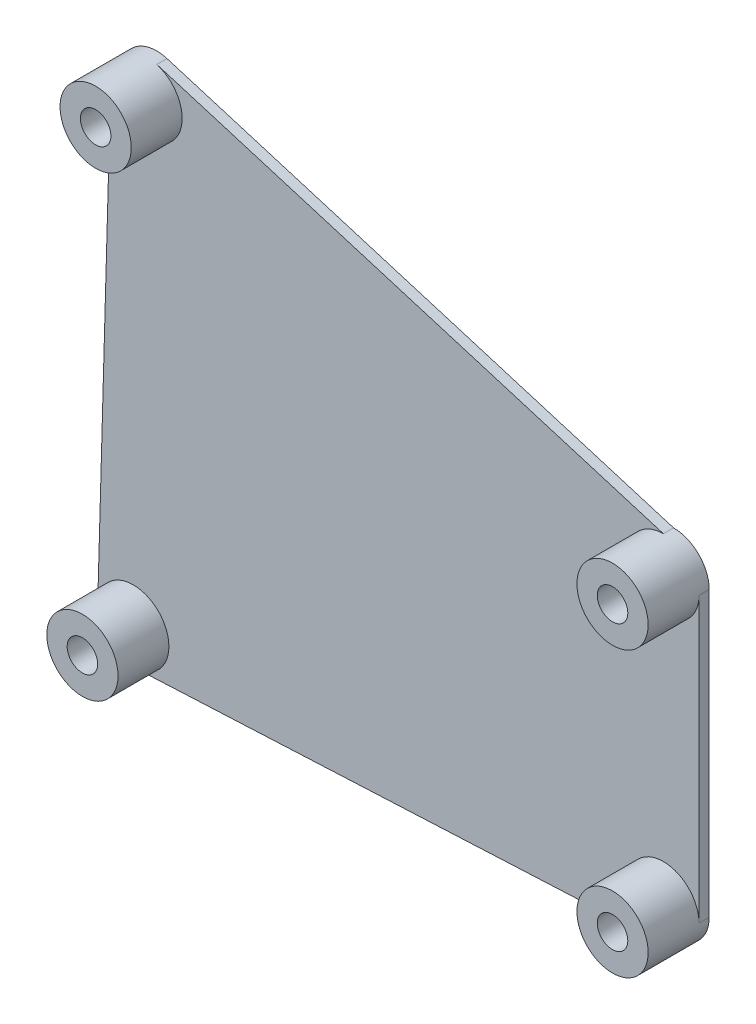
ISO-10303-21;
HEADER;
FILE_DESCRIPTION(('STEP AP214'),'2;1');
FILE_NAME('part.step','',(''),(''),'','','');
FILE_SCHEMA(('AUTOMOTIVE_DESIGN { 1 0 10303 214 1 1 1 1 }'));
ENDSEC;
DATA;
#1=APPLICATION_CONTEXT('core data for automotive mechanical design processes');
#2=APPLICATION_PROTOCOL_DEFINITION('international standard','automotive_design',2000,#1);
#3=PRODUCT_CONTEXT('',#1,'mechanical');
#4=PRODUCT('Part','Part','',(#3));
#5=PRODUCT_RELATED_PRODUCT_CATEGORY('part','',(#4));
#6=PRODUCT_DEFINITION_FORMATION('','',#4);
#7=PRODUCT_DEFINITION_CONTEXT('part definition',#1,'design');
#8=PRODUCT_DEFINITION('design','',#6,#7);
#9=PRODUCT_DEFINITION_SHAPE('','',#8);
#10=(LENGTH_UNIT() NAMED_UNIT(*) SI_UNIT(.MILLI.,.METRE.));
#11=(NAMED_UNIT(*) PLANE_ANGLE_UNIT() SI_UNIT($,.RADIAN.));
#12=(NAMED_UNIT(*) SI_UNIT($,.STERADIAN.) SOLID_ANGLE_UNIT());
#13=UNCERTAINTY_MEASURE_WITH_UNIT(LENGTH_MEASURE(1.E-05),#10,'distance_accuracy_value','');
#14=(GEOMETRIC_REPRESENTATION_CONTEXT(3) GLOBAL_UNCERTAINTY_ASSIGNED_CONTEXT((#13)) GLOBAL_UNIT_ASSIGNED_CONTEXT((#10,
#11,#12)) REPRESENTATION_CONTEXT('',''));
#15=CARTESIAN_POINT('',(0.,0.,0.));
#16=DIRECTION('',(0.,0.,1.));
#17=DIRECTION('',(1.,0.,0.));
#18=AXIS2_PLACEMENT_3D('',#15,#16,#17);
#19=CARTESIAN_POINT('',(13.7519462620591,45.4922997366841,-6.));
#20=DIRECTION('',(0.289359816805191,0.957220401171259,0.));
#21=DIRECTION('',(-0.957220401171259,0.289359816805191,0.));
#22=AXIS2_PLACEMENT_3D('',#19,#20,#21);
#23=PLANE('',#22);
#24=DIRECTION('',(0.,0.,1.));
#25=VECTOR('',#24,1.);
#26=CARTESIAN_POINT('',(2.31275935881816,48.9502714040994,-6.));
#27=LINE('',#26,#25);
#28=CARTESIAN_POINT('',(2.31275935881816,48.9502714040994,-6.));
#29=VERTEX_POINT('',#28);
#30=CARTESIAN_POINT('',(2.31275935881816,48.9502714040994,-5.));
#31=VERTEX_POINT('',#30);
#32=EDGE_CURVE('E44',#29,#31,#27,.T.);
#33=ORIENTED_EDGE('',*,*,#32,.T.);
#34=DIRECTION('',(0.957220401171259,-0.289359816805191,0.));
#35=VECTOR('',#34,1.);
#36=CARTESIAN_POINT('',(13.7519462620591,45.4922997366841,-5.));
#37=LINE('',#36,#35);
#38=CARTESIAN_POINT('',(52.1,33.9,-5.));
#39=VERTEX_POINT('',#38);
#40=EDGE_CURVE('E220',#31,#39,#37,.T.);
#41=ORIENTED_EDGE('',*,*,#40,.T.);
#42=DIRECTION('',(0.,0.,1.));
#43=VECTOR('',#42,1.);
#44=CARTESIAN_POINT('',(52.1,33.9,-6.));
#45=LINE('',#44,#43);
#46=CARTESIAN_POINT('',(52.1,33.9,-6.));
#47=VERTEX_POINT('',#46);
#48=EDGE_CURVE('E12',#47,#39,#45,.T.);
#49=ORIENTED_EDGE('',*,*,#48,.F.);
#50=DIRECTION('',(-0.957220401171259,0.289359816805191,0.));
#51=VECTOR('',#50,1.);
#52=CARTESIAN_POINT('',(13.7519462620591,45.4922997366841,-6.));
#53=LINE('',#52,#51);
#54=EDGE_CURVE('E202',#47,#29,#53,.T.);
#55=ORIENTED_EDGE('',*,*,#54,.T.);
#56=EDGE_LOOP('',(#33,#41,#49,#55));
#57=FACE_BOUND('',#56,.T.);
#58=ADVANCED_FACE('F41',(#57),#23,.T.);
#59=CARTESIAN_POINT('',(55.6,0.,-6.));
#60=DIRECTION('',(-1.,0.,0.));
#61=DIRECTION('',(0.,-1.,0.));
#62=AXIS2_PLACEMENT_3D('',#59,#60,#61);
#63=PLANE('',#62);
#64=DIRECTION('',(0.,1.,0.));
#65=VECTOR('',#64,1.);
#66=CARTESIAN_POINT('',(55.6,0.,-5.));
#67=LINE('',#66,#65);
#68=CARTESIAN_POINT('',(55.6,2.5,-5.));
#69=VERTEX_POINT('',#68);
#70=CARTESIAN_POINT('',(55.6,30.4,-5.));
#71=VERTEX_POINT('',#70);
#72=EDGE_CURVE('E129',#69,#71,#67,.T.);
#73=ORIENTED_EDGE('',*,*,#72,.F.);
#74=DIRECTION('',(0.,0.,1.));
#75=VECTOR('',#74,1.);
#76=CARTESIAN_POINT('',(55.6,2.5,-6.));
#77=LINE('',#76,#75);
#78=CARTESIAN_POINT('',(55.6,2.5,-6.));
#79=VERTEX_POINT('',#78);
#80=EDGE_CURVE('E125',#79,#69,#77,.T.);
#81=ORIENTED_EDGE('',*,*,#80,.F.);
#82=DIRECTION('',(0.,-1.,0.));
#83=VECTOR('',#82,1.);
#84=CARTESIAN_POINT('',(55.6,0.,-6.));
#85=LINE('',#84,#83);
#86=CARTESIAN_POINT('',(55.6,30.4,-6.));
#87=VERTEX_POINT('',#86);
#88=EDGE_CURVE('E109',#87,#79,#85,.T.);
#89=ORIENTED_EDGE('',*,*,#88,.F.);
#90=DIRECTION('',(0.,0.,1.));
#91=VECTOR('',#90,1.);
#92=CARTESIAN_POINT('',(55.6,30.4,-6.));
#93=LINE('',#92,#91);
#94=EDGE_CURVE('E50',#87,#71,#93,.T.);
#95=ORIENTED_EDGE('',*,*,#94,.T.);
#96=EDGE_LOOP('',(#73,#81,#89,#95));
#97=FACE_BOUND('',#96,.T.);
#98=ADVANCED_FACE('F126',(#97),#63,.F.);
#99=CARTESIAN_POINT('',(0.167560444892048,-3.49195967155029,-6.));
#100=DIRECTION('',(0.0479294971799037,-0.998850721229194,0.));
#101=DIRECTION('',(0.998850721229194,0.0479294971799038,0.));
#102=AXIS2_PLACEMENT_3D('',#99,#100,#101);
#103=PLANE('',#102);
#104=DIRECTION('',(-0.998850721229194,-0.0479294971799037,0.));
#105=VECTOR('',#104,1.);
#106=CARTESIAN_POINT('',(0.167560444892048,-3.49195967155029,-5.));
#107=LINE('',#106,#105);
#108=CARTESIAN_POINT('',(52.1,-1.,-5.));
#109=VERTEX_POINT('',#108);
#110=CARTESIAN_POINT('',(0.335120889784106,-3.48391934310057,-5.));
#111=VERTEX_POINT('',#110);
#112=EDGE_CURVE('E286',#109,#111,#107,.T.);
#113=ORIENTED_EDGE('',*,*,#112,.T.);
#114=DIRECTION('',(0.,0.,1.));
#115=VECTOR('',#114,1.);
#116=CARTESIAN_POINT('',(0.335120889784106,-3.48391934310057,-85.003053537954));
#117=LINE('',#116,#115);
#118=CARTESIAN_POINT('',(0.335120889784106,-3.48391934310057,0.));
#119=VERTEX_POINT('',#118);
#120=EDGE_CURVE('E257',#111,#119,#117,.T.);
#121=ORIENTED_EDGE('',*,*,#120,.T.);
#122=DIRECTION('',(0.998850721229194,0.0479294971799038,0.));
#123=VECTOR('',#122,1.);
#124=CARTESIAN_POINT('',(0.167560444892048,-3.49195967155029,0.));
#125=LINE('',#124,#123);
#126=CARTESIAN_POINT('',(0.,-3.5,0.));
#127=VERTEX_POINT('',#126);
#128=EDGE_CURVE('E175',#127,#119,#125,.T.);
#129=ORIENTED_EDGE('',*,*,#128,.F.);
#130=DIRECTION('',(0.,0.,1.));
#131=VECTOR('',#130,1.);
#132=CARTESIAN_POINT('',(0.,-3.5,-6.));
#133=LINE('',#132,#131);
#134=CARTESIAN_POINT('',(0.,-3.5,-6.));
#135=VERTEX_POINT('',#134);
#136=EDGE_CURVE('E82',#135,#127,#133,.T.);
#137=ORIENTED_EDGE('',*,*,#136,.F.);
#138=DIRECTION('',(0.998850721229194,0.0479294971799038,0.));
#139=VECTOR('',#138,1.);
#140=CARTESIAN_POINT('',(0.167560444892048,-3.49195967155029,-6.));
#141=LINE('',#140,#139);
#142=CARTESIAN_POINT('',(52.1,-1.,-6.));
#143=VERTEX_POINT('',#142);
#144=EDGE_CURVE('E138',#135,#143,#141,.T.);
#145=ORIENTED_EDGE('',*,*,#144,.T.);
#146=DIRECTION('',(0.,0.,1.));
#147=VECTOR('',#146,1.);
#148=CARTESIAN_POINT('',(52.1,-1.,-6.));
#149=LINE('',#148,#147);
#150=EDGE_CURVE('E133',#143,#109,#149,.T.);
#151=ORIENTED_EDGE('',*,*,#150,.T.);
#152=EDGE_LOOP('',(#113,#121,#129,#137,#145,#151));
#153=FACE_BOUND('',#152,.T.);
#154=ADVANCED_FACE('F291',(#153),#103,.T.);
#155=CARTESIAN_POINT('',(-3.49715768482257,0.0996996708392394,-6.));
#156=DIRECTION('',(-0.999593872504881,0.0284971937336917,0.));
#157=DIRECTION('',(-0.0284971937336917,-0.999593872504881,0.));
#158=AXIS2_PLACEMENT_3D('',#155,#156,#157);
#159=PLANE('',#158);
#160=DIRECTION('',(-0.0284971937336917,-0.999593872504881,0.));
#161=VECTOR('',#160,1.);
#162=CARTESIAN_POINT('',(-3.49715768482257,0.0996996708392394,0.));
#163=LINE('',#162,#161);
#164=CARTESIAN_POINT('',(-3.49431536964513,0.199399341678463,0.));
#165=VERTEX_POINT('',#164);
#166=CARTESIAN_POINT('',(-3.5,0.,0.));
#167=VERTEX_POINT('',#166);
#168=EDGE_CURVE('E167',#165,#167,#163,.T.);
#169=ORIENTED_EDGE('',*,*,#168,.F.);
#170=DIRECTION('',(0.,0.,1.));
#171=VECTOR('',#170,1.);
#172=CARTESIAN_POINT('',(-3.49431536964513,0.199399341678463,-85.003053537954));
#173=LINE('',#172,#171);
#174=CARTESIAN_POINT('',(-3.49431536964513,0.199399341678463,-5.));
#175=VERTEX_POINT('',#174);
#176=EDGE_CURVE('E58',#175,#165,#173,.T.);
#177=ORIENTED_EDGE('',*,*,#176,.F.);
#178=DIRECTION('',(0.0284971937336917,0.999593872504881,0.));
#179=VECTOR('',#178,1.);
#180=CARTESIAN_POINT('',(-3.49715768482257,0.0996996708392394,-5.));
#181=LINE('',#180,#179);
#182=CARTESIAN_POINT('',(-2.20000000000001,45.6,-5.));
#183=VERTEX_POINT('',#182);
#184=EDGE_CURVE('E168',#175,#183,#181,.T.);
#185=ORIENTED_EDGE('',*,*,#184,.T.);
#186=DIRECTION('',(0.,0.,1.));
#187=VECTOR('',#186,1.);
#188=CARTESIAN_POINT('',(-2.20000000000001,45.6,-6.));
#189=LINE('',#188,#187);
#190=CARTESIAN_POINT('',(-2.20000000000001,45.6,-6.));
#191=VERTEX_POINT('',#190);
#192=EDGE_CURVE('E213',#191,#183,#189,.T.);
#193=ORIENTED_EDGE('',*,*,#192,.F.);
#194=DIRECTION('',(-0.0284971937336917,-0.999593872504881,0.));
#195=VECTOR('',#194,1.);
#196=CARTESIAN_POINT('',(-3.49715768482257,0.0996996708392394,-6.));
#197=LINE('',#196,#195);
#198=CARTESIAN_POINT('',(-3.5,0.,-6.));
#199=VERTEX_POINT('',#198);
#200=EDGE_CURVE('E272',#191,#199,#197,.T.);
#201=ORIENTED_EDGE('',*,*,#200,.T.);
#202=DIRECTION('',(0.,0.,1.));
#203=VECTOR('',#202,1.);
#204=CARTESIAN_POINT('',(-3.5,0.,-6.));
#205=LINE('',#204,#203);
#206=EDGE_CURVE('E210',#199,#167,#205,.T.);
#207=ORIENTED_EDGE('',*,*,#206,.T.);
#208=EDGE_LOOP('',(#169,#177,#185,#193,#201,#207));
#209=FACE_BOUND('',#208,.T.);
#210=ADVANCED_FACE('F281',(#209),#159,.T.);
#211=CARTESIAN_POINT('',(0.,0.,0.));
#212=DIRECTION('',(0.,0.,1.));
#213=DIRECTION('',(1.,0.,0.));
#214=AXIS2_PLACEMENT_3D('',#211,#212,#213);
#215=PLANE('',#214);
#216=CARTESIAN_POINT('',(1.29999999999999,45.6,0.));
#217=DIRECTION('',(0.,0.,1.));
#218=DIRECTION('',(1.,0.,0.));
#219=AXIS2_PLACEMENT_3D('',#216,#217,#218);
#220=CIRCLE('',#219,1.5);
#221=CARTESIAN_POINT('',(2.8,45.6,0.));
#222=VERTEX_POINT('',#221);
#223=EDGE_CURVE('E199',#222,#222,#220,.T.);
#224=ORIENTED_EDGE('',*,*,#223,.F.);
#225=EDGE_LOOP('',(#224));
#226=FACE_BOUND('',#225,.T.);
#227=CARTESIAN_POINT('',(1.29999999999999,45.6,0.));
#228=DIRECTION('',(0.,0.,1.));
#229=DIRECTION('',(1.,0.,0.));
#230=AXIS2_PLACEMENT_3D('',#227,#228,#229);
#231=CIRCLE('',#230,3.5);
#232=CARTESIAN_POINT('',(4.8,45.6,0.));
#233=VERTEX_POINT('',#232);
#234=EDGE_CURVE('E163',#233,#233,#231,.T.);
#235=ORIENTED_EDGE('',*,*,#234,.T.);
#236=EDGE_LOOP('',(#235));
#237=FACE_BOUND('',#236,.T.);
#238=ADVANCED_FACE('F302',(#226,#237),#215,.T.);
#239=CARTESIAN_POINT('',(52.1,30.4,0.));
#240=DIRECTION('',(0.,0.,1.));
#241=DIRECTION('',(1.,0.,0.));
#242=AXIS2_PLACEMENT_3D('',#239,#240,#241);
#243=CIRCLE('',#242,1.5);
#244=CARTESIAN_POINT('',(53.6,30.4,0.));
#245=VERTEX_POINT('',#244);
#246=EDGE_CURVE('E187',#245,#245,#243,.T.);
#247=ORIENTED_EDGE('',*,*,#246,.F.);
#248=EDGE_LOOP('',(#247));
#249=FACE_BOUND('',#248,.T.);
#250=CARTESIAN_POINT('',(52.1,30.4,0.));
#251=DIRECTION('',(0.,0.,1.));
#252=DIRECTION('',(1.,0.,0.));
#253=AXIS2_PLACEMENT_3D('',#250,#251,#252);
#254=CIRCLE('',#253,3.5);
#255=CARTESIAN_POINT('',(55.6,30.4,0.));
#256=VERTEX_POINT('',#255);
#257=EDGE_CURVE('E183',#256,#256,#254,.T.);
#258=ORIENTED_EDGE('',*,*,#257,.T.);
#259=EDGE_LOOP('',(#258));
#260=FACE_BOUND('',#259,.T.);
#261=ADVANCED_FACE('F309',(#249,#260),#215,.T.);
#262=CARTESIAN_POINT('',(52.1,2.5,0.));
#263=DIRECTION('',(0.,0.,1.));
#264=DIRECTION('',(1.,0.,0.));
#265=AXIS2_PLACEMENT_3D('',#262,#263,#264);
#266=CIRCLE('',#265,1.5);
#267=CARTESIAN_POINT('',(53.6,2.5,0.));
#268=VERTEX_POINT('',#267);
#269=EDGE_CURVE('E191',#268,#268,#266,.T.);
#270=ORIENTED_EDGE('',*,*,#269,.F.);
#271=EDGE_LOOP('',(#270));
#272=FACE_BOUND('',#271,.T.);
#273=CARTESIAN_POINT('',(52.1,2.5,0.));
#274=DIRECTION('',(0.,0.,1.));
#275=DIRECTION('',(1.,0.,0.));
#276=AXIS2_PLACEMENT_3D('',#273,#274,#275);
#277=CIRCLE('',#276,3.5);
#278=CARTESIAN_POINT('',(55.6,2.5,0.));
#279=VERTEX_POINT('',#278);
#280=EDGE_CURVE('E179',#279,#279,#277,.T.);
#281=ORIENTED_EDGE('',*,*,#280,.T.);
#282=EDGE_LOOP('',(#281));
#283=FACE_BOUND('',#282,.T.);
#284=ADVANCED_FACE('F299',(#272,#283),#215,.T.);
#285=CARTESIAN_POINT('',(0.,0.,0.));
#286=DIRECTION('',(0.,0.,1.));
#287=DIRECTION('',(1.,0.,0.));
#288=AXIS2_PLACEMENT_3D('',#285,#286,#287);
#289=CIRCLE('',#288,1.5);
#290=CARTESIAN_POINT('',(1.5,0.,0.));
#291=VERTEX_POINT('',#290);
#292=EDGE_CURVE('E195',#291,#291,#289,.T.);
#293=ORIENTED_EDGE('',*,*,#292,.F.);
#294=EDGE_LOOP('',(#293));
#295=FACE_BOUND('',#294,.T.);
#296=ORIENTED_EDGE('',*,*,#128,.T.);
#297=CARTESIAN_POINT('',(0.,0.,0.));
#298=DIRECTION('',(0.,0.,1.));
#299=DIRECTION('',(1.,0.,0.));
#300=AXIS2_PLACEMENT_3D('',#297,#298,#299);
#301=CIRCLE('',#300,3.5);
#302=EDGE_CURVE('E254',#119,#165,#301,.T.);
#303=ORIENTED_EDGE('',*,*,#302,.T.);
#304=ORIENTED_EDGE('',*,*,#168,.T.);
#305=CARTESIAN_POINT('',(0.,0.,0.));
#306=DIRECTION('',(0.,0.,1.));
#307=DIRECTION('',(1.,0.,0.));
#308=AXIS2_PLACEMENT_3D('',#305,#306,#307);
#309=CIRCLE('',#308,3.5);
#310=EDGE_CURVE('E171',#167,#127,#309,.T.);
#311=ORIENTED_EDGE('',*,*,#310,.T.);
#312=EDGE_LOOP('',(#296,#303,#304,#311));
#313=FACE_BOUND('',#312,.T.);
#314=ADVANCED_FACE('F296',(#295,#313),#215,.T.);
#315=CARTESIAN_POINT('',(52.1,30.4,-6.));
#316=DIRECTION('',(0.,0.,1.));
#317=DIRECTION('',(1.,0.,0.));
#318=AXIS2_PLACEMENT_3D('',#315,#316,#317);
#319=CYLINDRICAL_SURFACE('',#318,3.5);
#320=ORIENTED_EDGE('',*,*,#257,.F.);
#321=EDGE_LOOP('',(#320));
#322=FACE_BOUND('',#321,.T.);
#323=ORIENTED_EDGE('',*,*,#48,.T.);
#324=CARTESIAN_POINT('',(52.1,30.4,-5.));
#325=DIRECTION('',(0.,0.,1.));
#326=DIRECTION('',(1.,0.,0.));
#327=AXIS2_PLACEMENT_3D('',#324,#325,#326);
#328=CIRCLE('',#327,3.5);
#329=EDGE_CURVE('E240',#71,#39,#328,.F.);
#330=ORIENTED_EDGE('',*,*,#329,.F.);
#331=ORIENTED_EDGE('',*,*,#94,.F.);
#332=CARTESIAN_POINT('',(52.1,30.4,-6.));
#333=DIRECTION('',(0.,0.,1.));
#334=DIRECTION('',(1.,0.,0.));
#335=AXIS2_PLACEMENT_3D('',#332,#333,#334);
#336=CIRCLE('',#335,3.5);
#337=EDGE_CURVE('E118',#87,#47,#336,.T.);
#338=ORIENTED_EDGE('',*,*,#337,.T.);
#339=EDGE_LOOP('',(#323,#330,#331,#338));
#340=FACE_BOUND('',#339,.T.);
#341=ADVANCED_FACE('F298',(#322,#340),#319,.T.);
#342=CARTESIAN_POINT('',(52.1,2.5,-6.));
#343=DIRECTION('',(0.,0.,1.));
#344=DIRECTION('',(1.,0.,0.));
#345=AXIS2_PLACEMENT_3D('',#342,#343,#344);
#346=CYLINDRICAL_SURFACE('',#345,3.5);
#347=ORIENTED_EDGE('',*,*,#280,.F.);
#348=EDGE_LOOP('',(#347));
#349=FACE_BOUND('',#348,.T.);
#350=ORIENTED_EDGE('',*,*,#80,.T.);
#351=CARTESIAN_POINT('',(52.1,2.5,-5.));
#352=DIRECTION('',(0.,0.,1.));
#353=DIRECTION('',(1.,0.,0.));
#354=AXIS2_PLACEMENT_3D('',#351,#352,#353);
#355=CIRCLE('',#354,3.5);
#356=EDGE_CURVE('E248',#109,#69,#355,.F.);
#357=ORIENTED_EDGE('',*,*,#356,.F.);
#358=ORIENTED_EDGE('',*,*,#150,.F.);
#359=CARTESIAN_POINT('',(52.1,2.5,-6.));
#360=DIRECTION('',(0.,0.,1.));
#361=DIRECTION('',(1.,0.,0.));
#362=AXIS2_PLACEMENT_3D('',#359,#360,#361);
#363=CIRCLE('',#362,3.5);
#364=EDGE_CURVE('E115',#143,#79,#363,.T.);
#365=ORIENTED_EDGE('',*,*,#364,.T.);
#366=EDGE_LOOP('',(#350,#357,#358,#365));
#367=FACE_BOUND('',#366,.T.);
#368=ADVANCED_FACE('F135',(#349,#367),#346,.T.);
#369=CARTESIAN_POINT('',(0.,0.,-6.));
#370=DIRECTION('',(0.,0.,1.));
#371=DIRECTION('',(1.,0.,0.));
#372=AXIS2_PLACEMENT_3D('',#369,#370,#371);
#373=CYLINDRICAL_SURFACE('',#372,3.5);
#374=ORIENTED_EDGE('',*,*,#310,.F.);
#375=ORIENTED_EDGE('',*,*,#206,.F.);
#376=CARTESIAN_POINT('',(0.,0.,-6.));
#377=DIRECTION('',(0.,0.,1.));
#378=DIRECTION('',(1.,0.,0.));
#379=AXIS2_PLACEMENT_3D('',#376,#377,#378);
#380=CIRCLE('',#379,3.5);
#381=EDGE_CURVE('E141',#199,#135,#380,.T.);
#382=ORIENTED_EDGE('',*,*,#381,.T.);
#383=ORIENTED_EDGE('',*,*,#136,.T.);
#384=EDGE_LOOP('',(#374,#375,#382,#383));
#385=FACE_BOUND('',#384,.T.);
#386=ADVANCED_FACE('F277',(#385),#373,.T.);
#387=CARTESIAN_POINT('',(0.,0.,-6.));
#388=DIRECTION('',(0.,0.,1.));
#389=DIRECTION('',(1.,0.,0.));
#390=AXIS2_PLACEMENT_3D('',#387,#388,#389);
#391=CYLINDRICAL_SURFACE('',#390,1.5);
#392=CARTESIAN_POINT('',(0.,0.,-6.));
#393=DIRECTION('',(0.,0.,1.));
#394=DIRECTION('',(1.,0.,0.));
#395=AXIS2_PLACEMENT_3D('',#392,#393,#394);
#396=CIRCLE('',#395,1.5);
#397=CARTESIAN_POINT('',(1.5,0.,-6.));
#398=VERTEX_POINT('',#397);
#399=EDGE_CURVE('E155',#398,#398,#396,.T.);
#400=ORIENTED_EDGE('',*,*,#399,.F.);
#401=EDGE_LOOP('',(#400));
#402=FACE_BOUND('',#401,.T.);
#403=ORIENTED_EDGE('',*,*,#292,.T.);
#404=EDGE_LOOP('',(#403));
#405=FACE_BOUND('',#404,.T.);
#406=ADVANCED_FACE('F332',(#402,#405),#391,.F.);
#407=CARTESIAN_POINT('',(52.1,2.5,-6.));
#408=DIRECTION('',(0.,0.,1.));
#409=DIRECTION('',(1.,0.,0.));
#410=AXIS2_PLACEMENT_3D('',#407,#408,#409);
#411=CYLINDRICAL_SURFACE('',#410,1.5);
#412=CARTESIAN_POINT('',(52.1,2.5,-6.));
#413=DIRECTION('',(0.,0.,1.));
#414=DIRECTION('',(1.,0.,0.));
#415=AXIS2_PLACEMENT_3D('',#412,#413,#414);
#416=CIRCLE('',#415,1.5);
#417=CARTESIAN_POINT('',(53.6,2.5,-6.));
#418=VERTEX_POINT('',#417);
#419=EDGE_CURVE('E151',#418,#418,#416,.T.);
#420=ORIENTED_EDGE('',*,*,#419,.F.);
#421=EDGE_LOOP('',(#420));
#422=FACE_BOUND('',#421,.T.);
#423=ORIENTED_EDGE('',*,*,#269,.T.);
#424=EDGE_LOOP('',(#423));
#425=FACE_BOUND('',#424,.T.);
#426=ADVANCED_FACE('F344',(#422,#425),#411,.F.);
#427=CARTESIAN_POINT('',(52.1,30.4,-6.));
#428=DIRECTION('',(0.,0.,1.));
#429=DIRECTION('',(1.,0.,0.));
#430=AXIS2_PLACEMENT_3D('',#427,#428,#429);
#431=CYLINDRICAL_SURFACE('',#430,1.5);
#432=CARTESIAN_POINT('',(52.1,30.4,-6.));
#433=DIRECTION('',(0.,0.,1.));
#434=DIRECTION('',(1.,0.,0.));
#435=AXIS2_PLACEMENT_3D('',#432,#433,#434);
#436=CIRCLE('',#435,1.5);
#437=CARTESIAN_POINT('',(53.6,30.4,-6.));
#438=VERTEX_POINT('',#437);
#439=EDGE_CURVE('E147',#438,#438,#436,.T.);
#440=ORIENTED_EDGE('',*,*,#439,.F.);
#441=EDGE_LOOP('',(#440));
#442=FACE_BOUND('',#441,.T.);
#443=ORIENTED_EDGE('',*,*,#246,.T.);
#444=EDGE_LOOP('',(#443));
#445=FACE_BOUND('',#444,.T.);
#446=ADVANCED_FACE('F337',(#442,#445),#431,.F.);
#447=CARTESIAN_POINT('',(1.29999999999999,45.6,-6.));
#448=DIRECTION('',(0.,0.,1.));
#449=DIRECTION('',(1.,0.,0.));
#450=AXIS2_PLACEMENT_3D('',#447,#448,#449);
#451=CYLINDRICAL_SURFACE('',#450,3.5);
#452=ORIENTED_EDGE('',*,*,#234,.F.);
#453=EDGE_LOOP('',(#452));
#454=FACE_BOUND('',#453,.T.);
#455=CARTESIAN_POINT('',(1.29999999999999,45.6,-5.));
#456=DIRECTION('',(0.,0.,1.));
#457=DIRECTION('',(1.,0.,0.));
#458=AXIS2_PLACEMENT_3D('',#455,#456,#457);
#459=CIRCLE('',#458,3.5);
#460=EDGE_CURVE('E224',#31,#183,#459,.F.);
#461=ORIENTED_EDGE('',*,*,#460,.F.);
#462=ORIENTED_EDGE('',*,*,#32,.F.);
#463=CARTESIAN_POINT('',(1.29999999999999,45.6,-6.));
#464=DIRECTION('',(0.,0.,1.));
#465=DIRECTION('',(1.,0.,0.));
#466=AXIS2_PLACEMENT_3D('',#463,#464,#465);
#467=CIRCLE('',#466,3.5);
#468=EDGE_CURVE('E269',#29,#191,#467,.T.);
#469=ORIENTED_EDGE('',*,*,#468,.T.);
#470=ORIENTED_EDGE('',*,*,#192,.T.);
#471=EDGE_LOOP('',(#461,#462,#469,#470));
#472=FACE_BOUND('',#471,.T.);
#473=ADVANCED_FACE('F334',(#454,#472),#451,.T.);
#474=CARTESIAN_POINT('',(1.29999999999999,45.6,-6.));
#475=DIRECTION('',(0.,0.,1.));
#476=DIRECTION('',(1.,0.,0.));
#477=AXIS2_PLACEMENT_3D('',#474,#475,#476);
#478=CYLINDRICAL_SURFACE('',#477,1.5);
#479=CARTESIAN_POINT('',(1.29999999999999,45.6,-6.));
#480=DIRECTION('',(0.,0.,1.));
#481=DIRECTION('',(1.,0.,0.));
#482=AXIS2_PLACEMENT_3D('',#479,#480,#481);
#483=CIRCLE('',#482,1.5);
#484=CARTESIAN_POINT('',(2.8,45.6,-6.));
#485=VERTEX_POINT('',#484);
#486=EDGE_CURVE('E159',#485,#485,#483,.T.);
#487=ORIENTED_EDGE('',*,*,#486,.F.);
#488=EDGE_LOOP('',(#487));
#489=FACE_BOUND('',#488,.T.);
#490=ORIENTED_EDGE('',*,*,#223,.T.);
#491=EDGE_LOOP('',(#490));
#492=FACE_BOUND('',#491,.T.);
#493=ADVANCED_FACE('F336',(#489,#492),#478,.F.);
#494=CARTESIAN_POINT('',(0.,0.,-6.));
#495=DIRECTION('',(0.,0.,1.));
#496=DIRECTION('',(1.,0.,0.));
#497=AXIS2_PLACEMENT_3D('',#494,#495,#496);
#498=PLANE('',#497);
#499=ORIENTED_EDGE('',*,*,#54,.F.);
#500=ORIENTED_EDGE('',*,*,#337,.F.);
#501=ORIENTED_EDGE('',*,*,#88,.T.);
#502=ORIENTED_EDGE('',*,*,#364,.F.);
#503=ORIENTED_EDGE('',*,*,#144,.F.);
#504=ORIENTED_EDGE('',*,*,#381,.F.);
#505=ORIENTED_EDGE('',*,*,#200,.F.);
#506=ORIENTED_EDGE('',*,*,#468,.F.);
#507=EDGE_LOOP('',(#499,#500,#501,#502,#503,#504,#505,#506));
#508=FACE_BOUND('',#507,.T.);
#509=ORIENTED_EDGE('',*,*,#439,.T.);
#510=EDGE_LOOP('',(#509));
#511=FACE_BOUND('',#510,.T.);
#512=ORIENTED_EDGE('',*,*,#419,.T.);
#513=EDGE_LOOP('',(#512));
#514=FACE_BOUND('',#513,.T.);
#515=ORIENTED_EDGE('',*,*,#399,.T.);
#516=EDGE_LOOP('',(#515));
#517=FACE_BOUND('',#516,.T.);
#518=ORIENTED_EDGE('',*,*,#486,.T.);
#519=EDGE_LOOP('',(#518));
#520=FACE_BOUND('',#519,.T.);
#521=ADVANCED_FACE('F111',(#508,#511,#514,#517,#520),#498,.F.);
#522=CARTESIAN_POINT('',(0.,0.,-85.003053537954));
#523=DIRECTION('',(0.,0.,1.));
#524=DIRECTION('',(1.,0.,0.));
#525=AXIS2_PLACEMENT_3D('',#522,#523,#524);
#526=CYLINDRICAL_SURFACE('',#525,3.5);
#527=ORIENTED_EDGE('',*,*,#176,.T.);
#528=ORIENTED_EDGE('',*,*,#302,.F.);
#529=ORIENTED_EDGE('',*,*,#120,.F.);
#530=CARTESIAN_POINT('',(0.,0.,-5.));
#531=DIRECTION('',(0.,0.,1.));
#532=DIRECTION('',(1.,0.,0.));
#533=AXIS2_PLACEMENT_3D('',#530,#531,#532);
#534=CIRCLE('',#533,3.5);
#535=EDGE_CURVE('E261',#175,#111,#534,.F.);
#536=ORIENTED_EDGE('',*,*,#535,.F.);
#537=EDGE_LOOP('',(#527,#528,#529,#536));
#538=FACE_BOUND('',#537,.T.);
#539=ADVANCED_FACE('F289',(#538),#526,.T.);
#540=CARTESIAN_POINT('',(0.,0.,-5.));
#541=DIRECTION('',(0.,0.,1.));
#542=DIRECTION('',(1.,0.,0.));
#543=AXIS2_PLACEMENT_3D('',#540,#541,#542);
#544=PLANE('',#543);
#545=ORIENTED_EDGE('',*,*,#40,.F.);
#546=ORIENTED_EDGE('',*,*,#460,.T.);
#547=ORIENTED_EDGE('',*,*,#184,.F.);
#548=ORIENTED_EDGE('',*,*,#535,.T.);
#549=ORIENTED_EDGE('',*,*,#112,.F.);
#550=ORIENTED_EDGE('',*,*,#356,.T.);
#551=ORIENTED_EDGE('',*,*,#72,.T.);
#552=ORIENTED_EDGE('',*,*,#329,.T.);
#553=EDGE_LOOP('',(#545,#546,#547,#548,#549,#550,#551,#552));
#554=FACE_BOUND('',#553,.T.);
#555=ADVANCED_FACE('F242',(#554),#544,.T.);
#556=CLOSED_SHELL('',(#58,#98,#154,#210,#238,#261,#284,#314,#341,#368,#386,#406,#426,#446,#473,
#493,#521,#539,#555));
#557=MANIFOLD_SOLID_BREP('B2',#556);
#558=ADVANCED_BREP_SHAPE_REPRESENTATION('',(#18,#557),#14);
#559=SHAPE_DEFINITION_REPRESENTATION(#9,#558);
ENDSEC;
END-ISO-10303-21;
